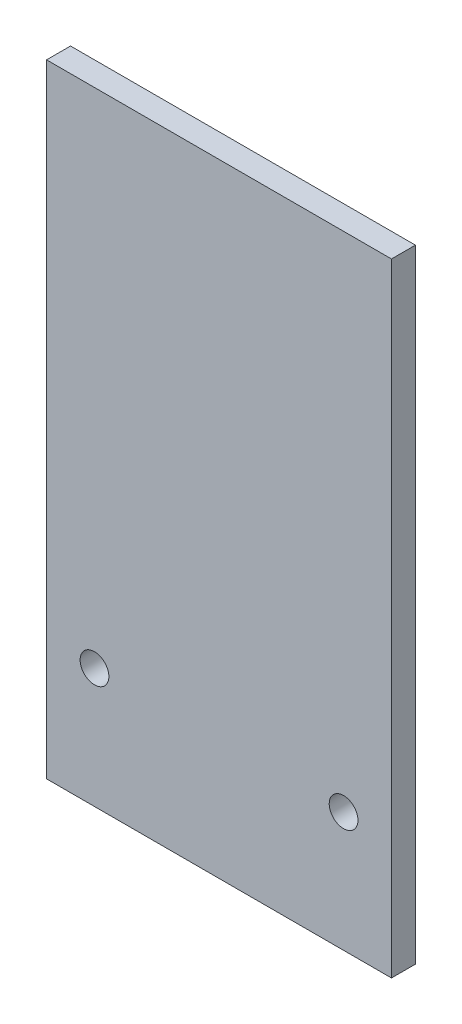
ISO-10303-21;
HEADER;
FILE_DESCRIPTION(('STEP AP214'),'2;1');
FILE_NAME('part.step','',(''),(''),'','','');
FILE_SCHEMA(('AUTOMOTIVE_DESIGN { 1 0 10303 214 1 1 1 1 }'));
ENDSEC;
DATA;
#1=APPLICATION_CONTEXT('core data for automotive mechanical design processes');
#2=APPLICATION_PROTOCOL_DEFINITION('international standard','automotive_design',2000,#1);
#3=PRODUCT_CONTEXT('',#1,'mechanical');
#4=PRODUCT('Part','Part','',(#3));
#5=PRODUCT_RELATED_PRODUCT_CATEGORY('part','',(#4));
#6=PRODUCT_DEFINITION_FORMATION('','',#4);
#7=PRODUCT_DEFINITION_CONTEXT('part definition',#1,'design');
#8=PRODUCT_DEFINITION('design','',#6,#7);
#9=PRODUCT_DEFINITION_SHAPE('','',#8);
#10=(LENGTH_UNIT() NAMED_UNIT(*) SI_UNIT(.MILLI.,.METRE.));
#11=(NAMED_UNIT(*) PLANE_ANGLE_UNIT() SI_UNIT($,.RADIAN.));
#12=(NAMED_UNIT(*) SI_UNIT($,.STERADIAN.) SOLID_ANGLE_UNIT());
#13=UNCERTAINTY_MEASURE_WITH_UNIT(LENGTH_MEASURE(1.E-05),#10,'distance_accuracy_value','');
#14=(GEOMETRIC_REPRESENTATION_CONTEXT(3) GLOBAL_UNCERTAINTY_ASSIGNED_CONTEXT((#13)) GLOBAL_UNIT_ASSIGNED_CONTEXT((#10,
#11,#12)) REPRESENTATION_CONTEXT('',''));
#15=CARTESIAN_POINT('',(0.,0.,0.));
#16=DIRECTION('',(0.,0.,1.));
#17=DIRECTION('',(1.,0.,0.));
#18=AXIS2_PLACEMENT_3D('',#15,#16,#17);
#19=CARTESIAN_POINT('',(36.,65.,5.));
#20=DIRECTION('',(-1.,0.,0.));
#21=DIRECTION('',(0.,-1.,0.));
#22=AXIS2_PLACEMENT_3D('',#19,#20,#21);
#23=PLANE('',#22);
#24=DIRECTION('',(0.,1.,0.));
#25=VECTOR('',#24,1.);
#26=CARTESIAN_POINT('',(36.,65.,0.));
#27=LINE('',#26,#25);
#28=CARTESIAN_POINT('',(36.,-65.,0.));
#29=VERTEX_POINT('',#28);
#30=CARTESIAN_POINT('',(36.,65.,0.));
#31=VERTEX_POINT('',#30);
#32=EDGE_CURVE('E100',#29,#31,#27,.T.);
#33=ORIENTED_EDGE('',*,*,#32,.T.);
#34=DIRECTION('',(0.,0.,-1.));
#35=VECTOR('',#34,1.);
#36=CARTESIAN_POINT('',(36.,65.,5.));
#37=LINE('',#36,#35);
#38=CARTESIAN_POINT('',(36.,65.,5.));
#39=VERTEX_POINT('',#38);
#40=EDGE_CURVE('E11',#39,#31,#37,.T.);
#41=ORIENTED_EDGE('',*,*,#40,.F.);
#42=DIRECTION('',(0.,1.,0.));
#43=VECTOR('',#42,1.);
#44=CARTESIAN_POINT('',(36.,65.,5.));
#45=LINE('',#44,#43);
#46=CARTESIAN_POINT('',(36.,-65.,5.));
#47=VERTEX_POINT('',#46);
#48=EDGE_CURVE('E88',#47,#39,#45,.T.);
#49=ORIENTED_EDGE('',*,*,#48,.F.);
#50=DIRECTION('',(0.,0.,-1.));
#51=VECTOR('',#50,1.);
#52=CARTESIAN_POINT('',(36.,-65.,5.));
#53=LINE('',#52,#51);
#54=EDGE_CURVE('E96',#47,#29,#53,.T.);
#55=ORIENTED_EDGE('',*,*,#54,.T.);
#56=EDGE_LOOP('',(#33,#41,#49,#55));
#57=FACE_BOUND('',#56,.T.);
#58=ADVANCED_FACE('F37',(#57),#23,.F.);
#59=CARTESIAN_POINT('',(-36.,65.,5.));
#60=DIRECTION('',(0.,-1.,0.));
#61=DIRECTION('',(0.,0.,-1.));
#62=AXIS2_PLACEMENT_3D('',#59,#60,#61);
#63=PLANE('',#62);
#64=DIRECTION('',(-1.,0.,0.));
#65=VECTOR('',#64,1.);
#66=CARTESIAN_POINT('',(-36.,65.,0.));
#67=LINE('',#66,#65);
#68=CARTESIAN_POINT('',(-36.,65.,0.));
#69=VERTEX_POINT('',#68);
#70=EDGE_CURVE('E92',#31,#69,#67,.T.);
#71=ORIENTED_EDGE('',*,*,#70,.T.);
#72=DIRECTION('',(0.,0.,-1.));
#73=VECTOR('',#72,1.);
#74=CARTESIAN_POINT('',(-36.,65.,5.));
#75=LINE('',#74,#73);
#76=CARTESIAN_POINT('',(-36.,65.,5.));
#77=VERTEX_POINT('',#76);
#78=EDGE_CURVE('E45',#77,#69,#75,.T.);
#79=ORIENTED_EDGE('',*,*,#78,.F.);
#80=DIRECTION('',(-1.,0.,0.));
#81=VECTOR('',#80,1.);
#82=CARTESIAN_POINT('',(-36.,65.,5.));
#83=LINE('',#82,#81);
#84=EDGE_CURVE('E83',#39,#77,#83,.T.);
#85=ORIENTED_EDGE('',*,*,#84,.F.);
#86=ORIENTED_EDGE('',*,*,#40,.T.);
#87=EDGE_LOOP('',(#71,#79,#85,#86));
#88=FACE_BOUND('',#87,.T.);
#89=ADVANCED_FACE('F91',(#88),#63,.F.);
#90=CARTESIAN_POINT('',(-36.,65.,5.));
#91=DIRECTION('',(1.,0.,0.));
#92=DIRECTION('',(0.,1.,0.));
#93=AXIS2_PLACEMENT_3D('',#90,#91,#92);
#94=PLANE('',#93);
#95=DIRECTION('',(0.,-1.,0.));
#96=VECTOR('',#95,1.);
#97=CARTESIAN_POINT('',(-36.,65.,0.));
#98=LINE('',#97,#96);
#99=CARTESIAN_POINT('',(-36.,-65.,0.));
#100=VERTEX_POINT('',#99);
#101=EDGE_CURVE('E70',#69,#100,#98,.T.);
#102=ORIENTED_EDGE('',*,*,#101,.T.);
#103=DIRECTION('',(0.,0.,-1.));
#104=VECTOR('',#103,1.);
#105=CARTESIAN_POINT('',(-36.,-65.,5.));
#106=LINE('',#105,#104);
#107=CARTESIAN_POINT('',(-36.,-65.,5.));
#108=VERTEX_POINT('',#107);
#109=EDGE_CURVE('E93',#108,#100,#106,.T.);
#110=ORIENTED_EDGE('',*,*,#109,.F.);
#111=DIRECTION('',(0.,-1.,0.));
#112=VECTOR('',#111,1.);
#113=CARTESIAN_POINT('',(-36.,65.,5.));
#114=LINE('',#113,#112);
#115=EDGE_CURVE('E86',#77,#108,#114,.T.);
#116=ORIENTED_EDGE('',*,*,#115,.F.);
#117=ORIENTED_EDGE('',*,*,#78,.T.);
#118=EDGE_LOOP('',(#102,#110,#116,#117));
#119=FACE_BOUND('',#118,.T.);
#120=ADVANCED_FACE('F94',(#119),#94,.F.);
#121=CARTESIAN_POINT('',(-36.,-65.,5.));
#122=DIRECTION('',(0.,1.,0.));
#123=DIRECTION('',(0.,0.,1.));
#124=AXIS2_PLACEMENT_3D('',#121,#122,#123);
#125=PLANE('',#124);
#126=DIRECTION('',(1.,0.,0.));
#127=VECTOR('',#126,1.);
#128=CARTESIAN_POINT('',(-36.,-65.,0.));
#129=LINE('',#128,#127);
#130=EDGE_CURVE('E76',#100,#29,#129,.T.);
#131=ORIENTED_EDGE('',*,*,#130,.T.);
#132=ORIENTED_EDGE('',*,*,#54,.F.);
#133=DIRECTION('',(1.,0.,0.));
#134=VECTOR('',#133,1.);
#135=CARTESIAN_POINT('',(-36.,-65.,5.));
#136=LINE('',#135,#134);
#137=EDGE_CURVE('E53',#108,#47,#136,.T.);
#138=ORIENTED_EDGE('',*,*,#137,.F.);
#139=ORIENTED_EDGE('',*,*,#109,.T.);
#140=EDGE_LOOP('',(#131,#132,#138,#139));
#141=FACE_BOUND('',#140,.T.);
#142=ADVANCED_FACE('F108',(#141),#125,.F.);
#143=CARTESIAN_POINT('',(0.,0.,5.));
#144=DIRECTION('',(0.,0.,1.));
#145=DIRECTION('',(1.,0.,0.));
#146=AXIS2_PLACEMENT_3D('',#143,#144,#145);
#147=PLANE('',#146);
#148=CARTESIAN_POINT('',(-26.,-40.,5.));
#149=DIRECTION('',(0.,0.,1.));
#150=DIRECTION('',(1.,0.,0.));
#151=AXIS2_PLACEMENT_3D('',#148,#149,#150);
#152=CIRCLE('',#151,3.);
#153=CARTESIAN_POINT('',(-23.,-40.,5.));
#154=VERTEX_POINT('',#153);
#155=EDGE_CURVE('E120',#154,#154,#152,.T.);
#156=ORIENTED_EDGE('',*,*,#155,.F.);
#157=EDGE_LOOP('',(#156));
#158=FACE_BOUND('',#157,.T.);
#159=CARTESIAN_POINT('',(26.,-40.,5.));
#160=DIRECTION('',(0.,0.,1.));
#161=DIRECTION('',(-1.,0.,0.));
#162=AXIS2_PLACEMENT_3D('',#159,#160,#161);
#163=CIRCLE('',#162,2.99999999999999);
#164=CARTESIAN_POINT('',(23.,-40.,5.));
#165=VERTEX_POINT('',#164);
#166=EDGE_CURVE('E114',#165,#165,#163,.T.);
#167=ORIENTED_EDGE('',*,*,#166,.F.);
#168=EDGE_LOOP('',(#167));
#169=FACE_BOUND('',#168,.T.);
#170=ORIENTED_EDGE('',*,*,#48,.T.);
#171=ORIENTED_EDGE('',*,*,#84,.T.);
#172=ORIENTED_EDGE('',*,*,#115,.T.);
#173=ORIENTED_EDGE('',*,*,#137,.T.);
#174=EDGE_LOOP('',(#170,#171,#172,#173));
#175=FACE_BOUND('',#174,.T.);
#176=ADVANCED_FACE('F84',(#158,#169,#175),#147,.T.);
#177=CARTESIAN_POINT('',(0.,0.,0.));
#178=DIRECTION('',(0.,0.,1.));
#179=DIRECTION('',(1.,0.,0.));
#180=AXIS2_PLACEMENT_3D('',#177,#178,#179);
#181=PLANE('',#180);
#182=CARTESIAN_POINT('',(-26.,-40.,0.));
#183=DIRECTION('',(0.,0.,1.));
#184=DIRECTION('',(1.,0.,0.));
#185=AXIS2_PLACEMENT_3D('',#182,#183,#184);
#186=CIRCLE('',#185,3.);
#187=CARTESIAN_POINT('',(-23.,-40.,0.));
#188=VERTEX_POINT('',#187);
#189=EDGE_CURVE('E103',#188,#188,#186,.T.);
#190=ORIENTED_EDGE('',*,*,#189,.T.);
#191=EDGE_LOOP('',(#190));
#192=FACE_BOUND('',#191,.T.);
#193=CARTESIAN_POINT('',(26.,-40.,0.));
#194=DIRECTION('',(0.,0.,1.));
#195=DIRECTION('',(-1.,0.,0.));
#196=AXIS2_PLACEMENT_3D('',#193,#194,#195);
#197=CIRCLE('',#196,2.99999999999999);
#198=CARTESIAN_POINT('',(23.,-40.,0.));
#199=VERTEX_POINT('',#198);
#200=EDGE_CURVE('E117',#199,#199,#197,.T.);
#201=ORIENTED_EDGE('',*,*,#200,.T.);
#202=EDGE_LOOP('',(#201));
#203=FACE_BOUND('',#202,.T.);
#204=ORIENTED_EDGE('',*,*,#32,.F.);
#205=ORIENTED_EDGE('',*,*,#130,.F.);
#206=ORIENTED_EDGE('',*,*,#101,.F.);
#207=ORIENTED_EDGE('',*,*,#70,.F.);
#208=EDGE_LOOP('',(#204,#205,#206,#207));
#209=FACE_BOUND('',#208,.T.);
#210=ADVANCED_FACE('F111',(#192,#203,#209),#181,.F.);
#211=CARTESIAN_POINT('',(26.,-40.,0.));
#212=DIRECTION('',(0.,0.,1.));
#213=DIRECTION('',(1.,0.,0.));
#214=AXIS2_PLACEMENT_3D('',#211,#212,#213);
#215=CYLINDRICAL_SURFACE('',#214,2.99999999999999);
#216=ORIENTED_EDGE('',*,*,#200,.F.);
#217=EDGE_LOOP('',(#216));
#218=FACE_BOUND('',#217,.T.);
#219=ORIENTED_EDGE('',*,*,#166,.T.);
#220=EDGE_LOOP('',(#219));
#221=FACE_BOUND('',#220,.T.);
#222=ADVANCED_FACE('F131',(#218,#221),#215,.F.);
#223=CARTESIAN_POINT('',(-26.,-40.,0.));
#224=DIRECTION('',(0.,0.,1.));
#225=DIRECTION('',(1.,0.,0.));
#226=AXIS2_PLACEMENT_3D('',#223,#224,#225);
#227=CYLINDRICAL_SURFACE('',#226,3.);
#228=ORIENTED_EDGE('',*,*,#189,.F.);
#229=EDGE_LOOP('',(#228));
#230=FACE_BOUND('',#229,.T.);
#231=ORIENTED_EDGE('',*,*,#155,.T.);
#232=EDGE_LOOP('',(#231));
#233=FACE_BOUND('',#232,.T.);
#234=ADVANCED_FACE('F128',(#230,#233),#227,.F.);
#235=CLOSED_SHELL('',(#58,#89,#120,#142,#176,#210,#222,#234));
#236=MANIFOLD_SOLID_BREP('B2',#235);
#237=ADVANCED_BREP_SHAPE_REPRESENTATION('',(#18,#236),#14);
#238=SHAPE_DEFINITION_REPRESENTATION(#9,#237);
ENDSEC;
END-ISO-10303-21;
